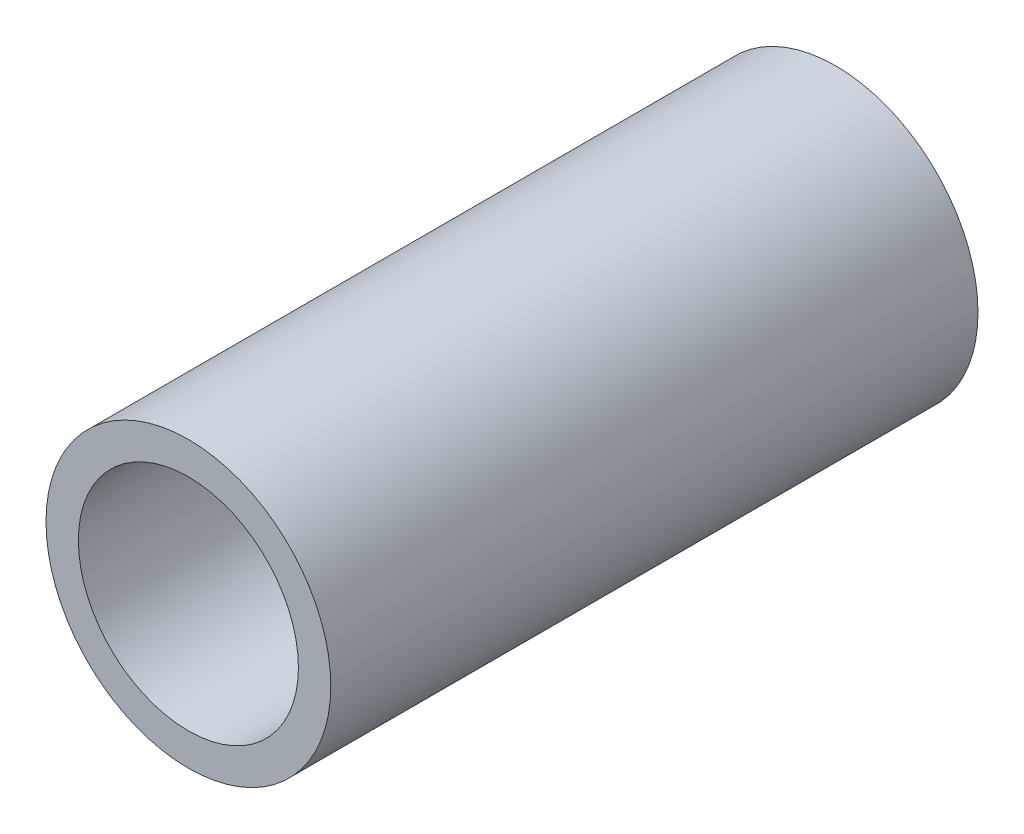
ISO-10303-21;
HEADER;
FILE_DESCRIPTION(('STEP AP214'),'2;1');
FILE_NAME('part.step','',(''),(''),'','','');
FILE_SCHEMA(('AUTOMOTIVE_DESIGN { 1 0 10303 214 1 1 1 1 }'));
ENDSEC;
DATA;
#1=APPLICATION_CONTEXT('core data for automotive mechanical design processes');
#2=APPLICATION_PROTOCOL_DEFINITION('international standard','automotive_design',2000,#1);
#3=PRODUCT_CONTEXT('',#1,'mechanical');
#4=PRODUCT('Part','Part','',(#3));
#5=PRODUCT_RELATED_PRODUCT_CATEGORY('part','',(#4));
#6=PRODUCT_DEFINITION_FORMATION('','',#4);
#7=PRODUCT_DEFINITION_CONTEXT('part definition',#1,'design');
#8=PRODUCT_DEFINITION('design','',#6,#7);
#9=PRODUCT_DEFINITION_SHAPE('','',#8);
#10=(LENGTH_UNIT() NAMED_UNIT(*) SI_UNIT(.MILLI.,.METRE.));
#11=(NAMED_UNIT(*) PLANE_ANGLE_UNIT() SI_UNIT($,.RADIAN.));
#12=(NAMED_UNIT(*) SI_UNIT($,.STERADIAN.) SOLID_ANGLE_UNIT());
#13=UNCERTAINTY_MEASURE_WITH_UNIT(LENGTH_MEASURE(1.E-05),#10,'distance_accuracy_value','');
#14=(GEOMETRIC_REPRESENTATION_CONTEXT(3) GLOBAL_UNCERTAINTY_ASSIGNED_CONTEXT((#13)) GLOBAL_UNIT_ASSIGNED_CONTEXT((#10,
#11,#12)) REPRESENTATION_CONTEXT('',''));
#15=CARTESIAN_POINT('',(0.,0.,0.));
#16=DIRECTION('',(0.,0.,1.));
#17=DIRECTION('',(1.,0.,0.));
#18=AXIS2_PLACEMENT_3D('',#15,#16,#17);
#19=CARTESIAN_POINT('',(0.,0.,10.));
#20=DIRECTION('',(0.,0.,1.));
#21=DIRECTION('',(1.,0.,0.));
#22=AXIS2_PLACEMENT_3D('',#19,#20,#21);
#23=PLANE('',#22);
#24=CARTESIAN_POINT('',(0.,0.,10.));
#25=DIRECTION('',(0.,0.,1.));
#26=DIRECTION('',(1.,0.,0.));
#27=AXIS2_PLACEMENT_3D('',#24,#25,#26);
#28=CIRCLE('',#27,2.2);
#29=CARTESIAN_POINT('',(2.2,0.,10.));
#30=VERTEX_POINT('',#29);
#31=EDGE_CURVE('E10',#30,#30,#28,.T.);
#32=ORIENTED_EDGE('',*,*,#31,.T.);
#33=EDGE_LOOP('',(#32));
#34=FACE_BOUND('',#33,.T.);
#35=CARTESIAN_POINT('',(0.,0.,10.));
#36=DIRECTION('',(0.,0.,1.));
#37=DIRECTION('',(1.,0.,0.));
#38=AXIS2_PLACEMENT_3D('',#35,#36,#37);
#39=CIRCLE('',#38,1.7);
#40=CARTESIAN_POINT('',(1.7,0.,10.));
#41=VERTEX_POINT('',#40);
#42=EDGE_CURVE('E45',#41,#41,#39,.T.);
#43=ORIENTED_EDGE('',*,*,#42,.F.);
#44=EDGE_LOOP('',(#43));
#45=FACE_BOUND('',#44,.T.);
#46=ADVANCED_FACE('F34',(#34,#45),#23,.T.);
#47=CARTESIAN_POINT('',(0.,0.,0.));
#48=DIRECTION('',(0.,0.,1.));
#49=DIRECTION('',(1.,0.,0.));
#50=AXIS2_PLACEMENT_3D('',#47,#48,#49);
#51=PLANE('',#50);
#52=CARTESIAN_POINT('',(0.,0.,0.));
#53=DIRECTION('',(0.,0.,1.));
#54=DIRECTION('',(1.,0.,0.));
#55=AXIS2_PLACEMENT_3D('',#52,#53,#54);
#56=CIRCLE('',#55,2.2);
#57=CARTESIAN_POINT('',(2.2,0.,0.));
#58=VERTEX_POINT('',#57);
#59=EDGE_CURVE('E38',#58,#58,#56,.T.);
#60=ORIENTED_EDGE('',*,*,#59,.F.);
#61=EDGE_LOOP('',(#60));
#62=FACE_BOUND('',#61,.T.);
#63=CARTESIAN_POINT('',(0.,0.,0.));
#64=DIRECTION('',(0.,0.,1.));
#65=DIRECTION('',(1.,0.,0.));
#66=AXIS2_PLACEMENT_3D('',#63,#64,#65);
#67=CIRCLE('',#66,1.7);
#68=CARTESIAN_POINT('',(1.7,0.,0.));
#69=VERTEX_POINT('',#68);
#70=EDGE_CURVE('E47',#69,#69,#67,.T.);
#71=ORIENTED_EDGE('',*,*,#70,.T.);
#72=EDGE_LOOP('',(#71));
#73=FACE_BOUND('',#72,.T.);
#74=ADVANCED_FACE('F57',(#62,#73),#51,.F.);
#75=CARTESIAN_POINT('',(0.,0.,10.));
#76=DIRECTION('',(0.,0.,-1.));
#77=DIRECTION('',(-1.,0.,0.));
#78=AXIS2_PLACEMENT_3D('',#75,#76,#77);
#79=CYLINDRICAL_SURFACE('',#78,2.2);
#80=ORIENTED_EDGE('',*,*,#31,.F.);
#81=EDGE_LOOP('',(#80));
#82=FACE_BOUND('',#81,.T.);
#83=ORIENTED_EDGE('',*,*,#59,.T.);
#84=EDGE_LOOP('',(#83));
#85=FACE_BOUND('',#84,.T.);
#86=ADVANCED_FACE('F36',(#82,#85),#79,.T.);
#87=CARTESIAN_POINT('',(0.,0.,10.));
#88=DIRECTION('',(0.,0.,-1.));
#89=DIRECTION('',(-1.,0.,0.));
#90=AXIS2_PLACEMENT_3D('',#87,#88,#89);
#91=CYLINDRICAL_SURFACE('',#90,1.7);
#92=ORIENTED_EDGE('',*,*,#42,.T.);
#93=EDGE_LOOP('',(#92));
#94=FACE_BOUND('',#93,.T.);
#95=ORIENTED_EDGE('',*,*,#70,.F.);
#96=EDGE_LOOP('',(#95));
#97=FACE_BOUND('',#96,.T.);
#98=ADVANCED_FACE('F53',(#94,#97),#91,.F.);
#99=CLOSED_SHELL('',(#46,#74,#86,#98));
#100=MANIFOLD_SOLID_BREP('B2',#99);
#101=ADVANCED_BREP_SHAPE_REPRESENTATION('',(#18,#100),#14);
#102=SHAPE_DEFINITION_REPRESENTATION(#9,#101);
ENDSEC;
END-ISO-10303-21;
